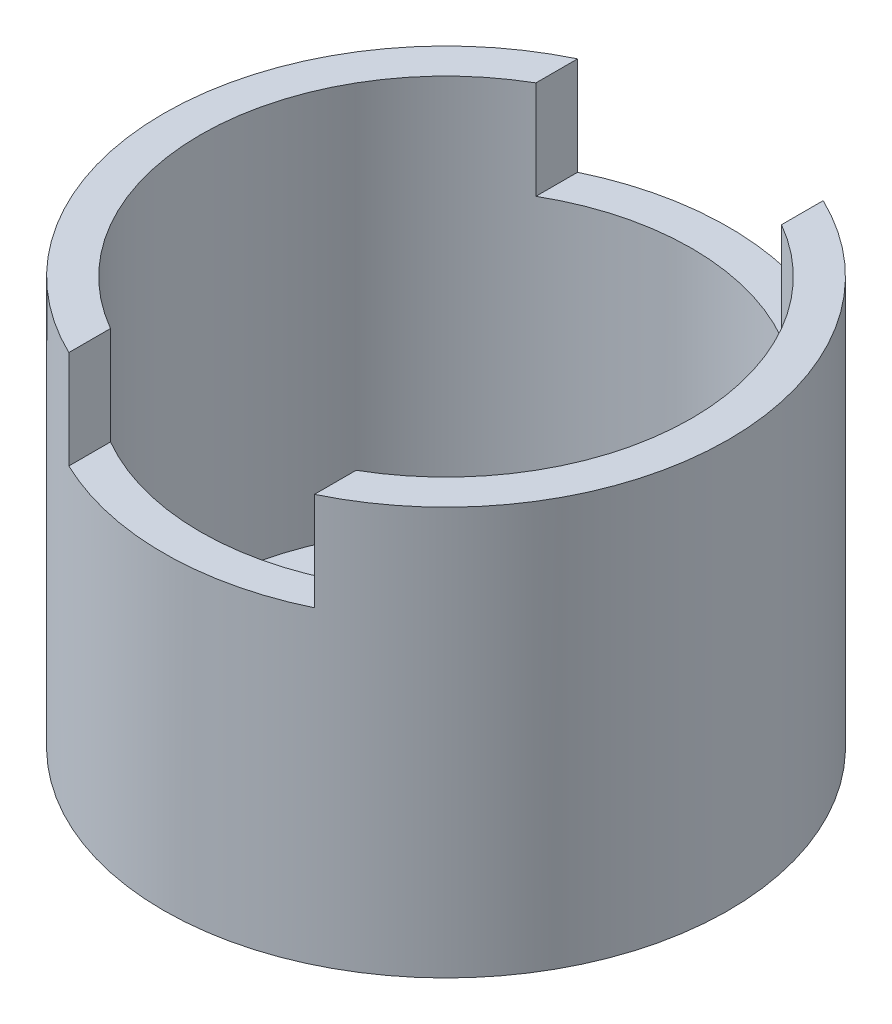
ISO-10303-21;
HEADER;
FILE_DESCRIPTION(('STEP AP214'),'2;1');
FILE_NAME('part.step','',(''),(''),'','','');
FILE_SCHEMA(('AUTOMOTIVE_DESIGN { 1 0 10303 214 1 1 1 1 }'));
ENDSEC;
DATA;
#1=APPLICATION_CONTEXT('core data for automotive mechanical design processes');
#2=APPLICATION_PROTOCOL_DEFINITION('international standard','automotive_design',2000,#1);
#3=PRODUCT_CONTEXT('',#1,'mechanical');
#4=PRODUCT('Part','Part','',(#3));
#5=PRODUCT_RELATED_PRODUCT_CATEGORY('part','',(#4));
#6=PRODUCT_DEFINITION_FORMATION('','',#4);
#7=PRODUCT_DEFINITION_CONTEXT('part definition',#1,'design');
#8=PRODUCT_DEFINITION('design','',#6,#7);
#9=PRODUCT_DEFINITION_SHAPE('','',#8);
#10=(LENGTH_UNIT() NAMED_UNIT(*) SI_UNIT(.MILLI.,.METRE.));
#11=(NAMED_UNIT(*) PLANE_ANGLE_UNIT() SI_UNIT($,.RADIAN.));
#12=(NAMED_UNIT(*) SI_UNIT($,.STERADIAN.) SOLID_ANGLE_UNIT());
#13=UNCERTAINTY_MEASURE_WITH_UNIT(LENGTH_MEASURE(1.E-05),#10,'distance_accuracy_value','');
#14=(GEOMETRIC_REPRESENTATION_CONTEXT(3) GLOBAL_UNCERTAINTY_ASSIGNED_CONTEXT((#13)) GLOBAL_UNIT_ASSIGNED_CONTEXT((#10,
#11,#12)) REPRESENTATION_CONTEXT('',''));
#15=CARTESIAN_POINT('',(0.,0.,0.));
#16=DIRECTION('',(0.,0.,1.));
#17=DIRECTION('',(1.,0.,0.));
#18=AXIS2_PLACEMENT_3D('',#15,#16,#17);
#19=CARTESIAN_POINT('',(0.,0.,0.));
#20=DIRECTION('',(0.,1.,0.));
#21=DIRECTION('',(0.,0.,1.));
#22=AXIS2_PLACEMENT_3D('',#19,#20,#21);
#23=PLANE('',#22);
#24=CARTESIAN_POINT('',(0.,0.,0.));
#25=DIRECTION('',(0.,1.,0.));
#26=DIRECTION('',(0.,0.,1.));
#27=AXIS2_PLACEMENT_3D('',#24,#25,#26);
#28=CIRCLE('',#27,13.5);
#29=CARTESIAN_POINT('',(0.,0.,13.5));
#30=VERTEX_POINT('',#29);
#31=EDGE_CURVE('E217',#30,#30,#28,.T.);
#32=ORIENTED_EDGE('',*,*,#31,.T.);
#33=EDGE_LOOP('',(#32));
#34=FACE_BOUND('',#33,.T.);
#35=CARTESIAN_POINT('',(11.5,0.,-11.5));
#36=DIRECTION('',(0.,1.,0.));
#37=DIRECTION('',(0.,0.,1.));
#38=AXIS2_PLACEMENT_3D('',#35,#36,#37);
#39=CIRCLE('',#38,1.4);
#40=CARTESIAN_POINT('',(11.5,0.,-10.1));
#41=VERTEX_POINT('',#40);
#42=EDGE_CURVE('E222',#41,#41,#39,.T.);
#43=ORIENTED_EDGE('',*,*,#42,.T.);
#44=EDGE_LOOP('',(#43));
#45=FACE_BOUND('',#44,.T.);
#46=CARTESIAN_POINT('',(-11.5,0.,-11.5));
#47=DIRECTION('',(0.,1.,0.));
#48=DIRECTION('',(0.,0.,1.));
#49=AXIS2_PLACEMENT_3D('',#46,#47,#48);
#50=CIRCLE('',#49,1.4);
#51=CARTESIAN_POINT('',(-11.5,0.,-10.1));
#52=VERTEX_POINT('',#51);
#53=EDGE_CURVE('E230',#52,#52,#50,.T.);
#54=ORIENTED_EDGE('',*,*,#53,.T.);
#55=EDGE_LOOP('',(#54));
#56=FACE_BOUND('',#55,.T.);
#57=CARTESIAN_POINT('',(11.5,0.,11.5));
#58=DIRECTION('',(0.,1.,0.));
#59=DIRECTION('',(0.,0.,1.));
#60=AXIS2_PLACEMENT_3D('',#57,#58,#59);
#61=CIRCLE('',#60,1.4);
#62=CARTESIAN_POINT('',(11.5,0.,12.9));
#63=VERTEX_POINT('',#62);
#64=EDGE_CURVE('E238',#63,#63,#61,.T.);
#65=ORIENTED_EDGE('',*,*,#64,.T.);
#66=EDGE_LOOP('',(#65));
#67=FACE_BOUND('',#66,.T.);
#68=CARTESIAN_POINT('',(-11.5,0.,11.5));
#69=DIRECTION('',(0.,1.,0.));
#70=DIRECTION('',(0.,0.,1.));
#71=AXIS2_PLACEMENT_3D('',#68,#69,#70);
#72=CIRCLE('',#71,1.4);
#73=CARTESIAN_POINT('',(-11.5,0.,12.9));
#74=VERTEX_POINT('',#73);
#75=EDGE_CURVE('E246',#74,#74,#72,.T.);
#76=ORIENTED_EDGE('',*,*,#75,.T.);
#77=EDGE_LOOP('',(#76));
#78=FACE_BOUND('',#77,.T.);
#79=CARTESIAN_POINT('',(0.,0.,0.));
#80=DIRECTION('',(0.,1.,0.));
#81=DIRECTION('',(0.,0.,1.));
#82=AXIS2_PLACEMENT_3D('',#79,#80,#81);
#83=CIRCLE('',#82,57.5);
#84=CARTESIAN_POINT('',(0.,0.,57.5));
#85=VERTEX_POINT('',#84);
#86=EDGE_CURVE('E96',#85,#85,#83,.T.);
#87=ORIENTED_EDGE('',*,*,#86,.F.);
#88=EDGE_LOOP('',(#87));
#89=FACE_BOUND('',#88,.T.);
#90=ADVANCED_FACE('F93',(#34,#45,#56,#67,#78,#89),#23,.F.);
#91=CARTESIAN_POINT('',(0.,83.,0.));
#92=DIRECTION('',(0.,1.,0.));
#93=DIRECTION('',(0.,0.,1.));
#94=AXIS2_PLACEMENT_3D('',#91,#92,#93);
#95=PLANE('',#94);
#96=CARTESIAN_POINT('',(0.,83.,0.));
#97=DIRECTION('',(0.,1.,0.));
#98=DIRECTION('',(0.,0.,1.));
#99=AXIS2_PLACEMENT_3D('',#96,#97,#98);
#100=CIRCLE('',#99,57.5);
#101=CARTESIAN_POINT('',(25.,83.,51.78078794302));
#102=VERTEX_POINT('',#101);
#103=CARTESIAN_POINT('',(25.,83.,-51.78078794302));
#104=VERTEX_POINT('',#103);
#105=EDGE_CURVE('E213',#102,#104,#100,.T.);
#106=ORIENTED_EDGE('',*,*,#105,.T.);
#107=DIRECTION('',(0.,0.,1.));
#108=VECTOR('',#107,1.);
#109=CARTESIAN_POINT('',(25.,83.,0.));
#110=LINE('',#109,#108);
#111=CARTESIAN_POINT('',(25.,83.,-43.3012701892219));
#112=VERTEX_POINT('',#111);
#113=EDGE_CURVE('E201',#104,#112,#110,.T.);
#114=ORIENTED_EDGE('',*,*,#113,.T.);
#115=CARTESIAN_POINT('',(0.,83.,0.));
#116=DIRECTION('',(0.,1.,0.));
#117=DIRECTION('',(0.,0.,1.));
#118=AXIS2_PLACEMENT_3D('',#115,#116,#117);
#119=CIRCLE('',#118,50.);
#120=CARTESIAN_POINT('',(25.,83.,43.3012701892219));
#121=VERTEX_POINT('',#120);
#122=EDGE_CURVE('E208',#121,#112,#119,.T.);
#123=ORIENTED_EDGE('',*,*,#122,.F.);
#124=EDGE_CURVE('E171',#121,#102,#110,.T.);
#125=ORIENTED_EDGE('',*,*,#124,.T.);
#126=EDGE_LOOP('',(#106,#114,#123,#125));
#127=FACE_BOUND('',#126,.T.);
#128=ADVANCED_FACE('F294',(#127),#95,.T.);
#129=CARTESIAN_POINT('',(-25.,83.,-51.7807879430199));
#130=VERTEX_POINT('',#129);
#131=CARTESIAN_POINT('',(-25.,83.,51.7807879430199));
#132=VERTEX_POINT('',#131);
#133=EDGE_CURVE('E212',#130,#132,#100,.T.);
#134=ORIENTED_EDGE('',*,*,#133,.T.);
#135=DIRECTION('',(0.,0.,-1.));
#136=VECTOR('',#135,1.);
#137=CARTESIAN_POINT('',(-25.,83.,0.));
#138=LINE('',#137,#136);
#139=CARTESIAN_POINT('',(-25.,83.,43.3012701892219));
#140=VERTEX_POINT('',#139);
#141=EDGE_CURVE('E165',#132,#140,#138,.T.);
#142=ORIENTED_EDGE('',*,*,#141,.T.);
#143=CARTESIAN_POINT('',(-25.,83.,-43.3012701892219));
#144=VERTEX_POINT('',#143);
#145=EDGE_CURVE('E207',#144,#140,#119,.T.);
#146=ORIENTED_EDGE('',*,*,#145,.F.);
#147=EDGE_CURVE('E189',#144,#130,#138,.T.);
#148=ORIENTED_EDGE('',*,*,#147,.T.);
#149=EDGE_LOOP('',(#134,#142,#146,#148));
#150=FACE_BOUND('',#149,.T.);
#151=ADVANCED_FACE('F299',(#150),#95,.T.);
#152=CARTESIAN_POINT('',(0.,83.,0.));
#153=DIRECTION('',(0.,-1.,0.));
#154=DIRECTION('',(0.,0.,-1.));
#155=AXIS2_PLACEMENT_3D('',#152,#153,#154);
#156=CYLINDRICAL_SURFACE('',#155,57.5);
#157=DIRECTION('',(0.,-1.,0.));
#158=VECTOR('',#157,1.);
#159=CARTESIAN_POINT('',(25.,83.,-51.78078794302));
#160=LINE('',#159,#158);
#161=CARTESIAN_POINT('',(25.,63.,-51.78078794302));
#162=VERTEX_POINT('',#161);
#163=EDGE_CURVE('E204',#104,#162,#160,.T.);
#164=ORIENTED_EDGE('',*,*,#163,.F.);
#165=ORIENTED_EDGE('',*,*,#105,.F.);
#166=DIRECTION('',(0.,-1.,0.));
#167=VECTOR('',#166,1.);
#168=CARTESIAN_POINT('',(25.,83.,51.78078794302));
#169=LINE('',#168,#167);
#170=CARTESIAN_POINT('',(25.,63.,51.78078794302));
#171=VERTEX_POINT('',#170);
#172=EDGE_CURVE('E184',#171,#102,#169,.F.);
#173=ORIENTED_EDGE('',*,*,#172,.F.);
#174=CARTESIAN_POINT('',(0.,63.,0.));
#175=DIRECTION('',(0.,1.,0.));
#176=DIRECTION('',(0.,0.,1.));
#177=AXIS2_PLACEMENT_3D('',#174,#175,#176);
#178=CIRCLE('',#177,57.5);
#179=CARTESIAN_POINT('',(-25.,63.,51.7807879430199));
#180=VERTEX_POINT('',#179);
#181=EDGE_CURVE('E174',#180,#171,#178,.T.);
#182=ORIENTED_EDGE('',*,*,#181,.F.);
#183=DIRECTION('',(0.,-1.,0.));
#184=VECTOR('',#183,1.);
#185=CARTESIAN_POINT('',(-25.,83.,51.7807879430199));
#186=LINE('',#185,#184);
#187=EDGE_CURVE('E159',#132,#180,#186,.T.);
#188=ORIENTED_EDGE('',*,*,#187,.F.);
#189=ORIENTED_EDGE('',*,*,#133,.F.);
#190=DIRECTION('',(0.,-1.,0.));
#191=VECTOR('',#190,1.);
#192=CARTESIAN_POINT('',(-25.,83.,-51.7807879430199));
#193=LINE('',#192,#191);
#194=CARTESIAN_POINT('',(-25.,63.,-51.7807879430199));
#195=VERTEX_POINT('',#194);
#196=EDGE_CURVE('E195',#195,#130,#193,.F.);
#197=ORIENTED_EDGE('',*,*,#196,.F.);
#198=EDGE_CURVE('E186',#162,#195,#178,.T.);
#199=ORIENTED_EDGE('',*,*,#198,.F.);
#200=EDGE_LOOP('',(#164,#165,#173,#182,#188,#189,#197,#199));
#201=FACE_BOUND('',#200,.T.);
#202=ORIENTED_EDGE('',*,*,#86,.T.);
#203=EDGE_LOOP('',(#202));
#204=FACE_BOUND('',#203,.T.);
#205=ADVANCED_FACE('F181',(#201,#204),#156,.T.);
#206=CARTESIAN_POINT('',(0.,83.,0.));
#207=DIRECTION('',(0.,-1.,0.));
#208=DIRECTION('',(0.,0.,-1.));
#209=AXIS2_PLACEMENT_3D('',#206,#207,#208);
#210=CYLINDRICAL_SURFACE('',#209,50.);
#211=CARTESIAN_POINT('',(0.,3.,0.));
#212=DIRECTION('',(0.,1.,0.));
#213=DIRECTION('',(0.,0.,1.));
#214=AXIS2_PLACEMENT_3D('',#211,#212,#213);
#215=CIRCLE('',#214,50.);
#216=CARTESIAN_POINT('',(0.,3.,50.));
#217=VERTEX_POINT('',#216);
#218=EDGE_CURVE('E254',#217,#217,#215,.F.);
#219=ORIENTED_EDGE('',*,*,#218,.T.);
#220=EDGE_LOOP('',(#219));
#221=FACE_BOUND('',#220,.T.);
#222=ORIENTED_EDGE('',*,*,#122,.T.);
#223=DIRECTION('',(0.,-1.,0.));
#224=VECTOR('',#223,1.);
#225=CARTESIAN_POINT('',(25.,83.,-43.3012701892219));
#226=LINE('',#225,#224);
#227=CARTESIAN_POINT('',(25.,63.,-43.3012701892219));
#228=VERTEX_POINT('',#227);
#229=EDGE_CURVE('E12',#112,#228,#226,.T.);
#230=ORIENTED_EDGE('',*,*,#229,.T.);
#231=CARTESIAN_POINT('',(0.,63.,0.));
#232=DIRECTION('',(0.,1.,0.));
#233=DIRECTION('',(0.,0.,1.));
#234=AXIS2_PLACEMENT_3D('',#231,#232,#233);
#235=CIRCLE('',#234,50.);
#236=CARTESIAN_POINT('',(-25.,63.,-43.3012701892219));
#237=VERTEX_POINT('',#236);
#238=EDGE_CURVE('E264',#228,#237,#235,.T.);
#239=ORIENTED_EDGE('',*,*,#238,.T.);
#240=DIRECTION('',(0.,-1.,0.));
#241=VECTOR('',#240,1.);
#242=CARTESIAN_POINT('',(-25.,83.,-43.3012701892219));
#243=LINE('',#242,#241);
#244=EDGE_CURVE('E102',#237,#144,#243,.F.);
#245=ORIENTED_EDGE('',*,*,#244,.T.);
#246=ORIENTED_EDGE('',*,*,#145,.T.);
#247=DIRECTION('',(0.,-1.,0.));
#248=VECTOR('',#247,1.);
#249=CARTESIAN_POINT('',(-25.,83.,43.3012701892219));
#250=LINE('',#249,#248);
#251=CARTESIAN_POINT('',(-25.,63.,43.3012701892219));
#252=VERTEX_POINT('',#251);
#253=EDGE_CURVE('E263',#140,#252,#250,.T.);
#254=ORIENTED_EDGE('',*,*,#253,.T.);
#255=CARTESIAN_POINT('',(25.,63.,43.3012701892219));
#256=VERTEX_POINT('',#255);
#257=EDGE_CURVE('E176',#252,#256,#235,.T.);
#258=ORIENTED_EDGE('',*,*,#257,.T.);
#259=DIRECTION('',(0.,-1.,0.));
#260=VECTOR('',#259,1.);
#261=CARTESIAN_POINT('',(25.,83.,43.3012701892219));
#262=LINE('',#261,#260);
#263=EDGE_CURVE('E267',#256,#121,#262,.F.);
#264=ORIENTED_EDGE('',*,*,#263,.T.);
#265=EDGE_LOOP('',(#222,#230,#239,#245,#246,#254,#258,#264));
#266=FACE_BOUND('',#265,.T.);
#267=ADVANCED_FACE('F278',(#221,#266),#210,.F.);
#268=CARTESIAN_POINT('',(0.,3.,0.));
#269=DIRECTION('',(0.,1.,0.));
#270=DIRECTION('',(0.,0.,1.));
#271=AXIS2_PLACEMENT_3D('',#268,#269,#270);
#272=PLANE('',#271);
#273=CARTESIAN_POINT('',(0.,3.,0.));
#274=DIRECTION('',(0.,1.,0.));
#275=DIRECTION('',(0.,0.,1.));
#276=AXIS2_PLACEMENT_3D('',#273,#274,#275);
#277=CIRCLE('',#276,13.5);
#278=CARTESIAN_POINT('',(0.,3.,13.5));
#279=VERTEX_POINT('',#278);
#280=EDGE_CURVE('E218',#279,#279,#277,.T.);
#281=ORIENTED_EDGE('',*,*,#280,.F.);
#282=EDGE_LOOP('',(#281));
#283=FACE_BOUND('',#282,.T.);
#284=CARTESIAN_POINT('',(-11.5,3.,-11.5));
#285=DIRECTION('',(0.,1.,0.));
#286=DIRECTION('',(0.,0.,1.));
#287=AXIS2_PLACEMENT_3D('',#284,#285,#286);
#288=CIRCLE('',#287,1.4);
#289=CARTESIAN_POINT('',(-11.5,3.,-10.1));
#290=VERTEX_POINT('',#289);
#291=EDGE_CURVE('E234',#290,#290,#288,.T.);
#292=ORIENTED_EDGE('',*,*,#291,.F.);
#293=EDGE_LOOP('',(#292));
#294=FACE_BOUND('',#293,.T.);
#295=CARTESIAN_POINT('',(-11.5,3.,11.5));
#296=DIRECTION('',(0.,1.,0.));
#297=DIRECTION('',(0.,0.,1.));
#298=AXIS2_PLACEMENT_3D('',#295,#296,#297);
#299=CIRCLE('',#298,1.4);
#300=CARTESIAN_POINT('',(-11.5,3.,12.9));
#301=VERTEX_POINT('',#300);
#302=EDGE_CURVE('E250',#301,#301,#299,.T.);
#303=ORIENTED_EDGE('',*,*,#302,.F.);
#304=EDGE_LOOP('',(#303));
#305=FACE_BOUND('',#304,.T.);
#306=CARTESIAN_POINT('',(11.5,3.,11.5));
#307=DIRECTION('',(0.,1.,0.));
#308=DIRECTION('',(0.,0.,1.));
#309=AXIS2_PLACEMENT_3D('',#306,#307,#308);
#310=CIRCLE('',#309,1.4);
#311=CARTESIAN_POINT('',(11.5,3.,12.9));
#312=VERTEX_POINT('',#311);
#313=EDGE_CURVE('E242',#312,#312,#310,.T.);
#314=ORIENTED_EDGE('',*,*,#313,.F.);
#315=EDGE_LOOP('',(#314));
#316=FACE_BOUND('',#315,.T.);
#317=CARTESIAN_POINT('',(11.5,3.,-11.5));
#318=DIRECTION('',(0.,1.,0.));
#319=DIRECTION('',(0.,0.,1.));
#320=AXIS2_PLACEMENT_3D('',#317,#318,#319);
#321=CIRCLE('',#320,1.4);
#322=CARTESIAN_POINT('',(11.5,3.,-10.1));
#323=VERTEX_POINT('',#322);
#324=EDGE_CURVE('E226',#323,#323,#321,.T.);
#325=ORIENTED_EDGE('',*,*,#324,.F.);
#326=EDGE_LOOP('',(#325));
#327=FACE_BOUND('',#326,.T.);
#328=ORIENTED_EDGE('',*,*,#218,.F.);
#329=EDGE_LOOP('',(#328));
#330=FACE_BOUND('',#329,.T.);
#331=ADVANCED_FACE('F315',(#283,#294,#305,#316,#327,#330),#272,.T.);
#332=CARTESIAN_POINT('',(-11.5,3.,11.5));
#333=DIRECTION('',(0.,-1.,0.));
#334=DIRECTION('',(0.,0.,-1.));
#335=AXIS2_PLACEMENT_3D('',#332,#333,#334);
#336=CYLINDRICAL_SURFACE('',#335,1.4);
#337=ORIENTED_EDGE('',*,*,#302,.T.);
#338=EDGE_LOOP('',(#337));
#339=FACE_BOUND('',#338,.T.);
#340=ORIENTED_EDGE('',*,*,#75,.F.);
#341=EDGE_LOOP('',(#340));
#342=FACE_BOUND('',#341,.T.);
#343=ADVANCED_FACE('F312',(#339,#342),#336,.F.);
#344=CARTESIAN_POINT('',(11.5,3.,11.5));
#345=DIRECTION('',(0.,-1.,0.));
#346=DIRECTION('',(0.,0.,-1.));
#347=AXIS2_PLACEMENT_3D('',#344,#345,#346);
#348=CYLINDRICAL_SURFACE('',#347,1.4);
#349=ORIENTED_EDGE('',*,*,#313,.T.);
#350=EDGE_LOOP('',(#349));
#351=FACE_BOUND('',#350,.T.);
#352=ORIENTED_EDGE('',*,*,#64,.F.);
#353=EDGE_LOOP('',(#352));
#354=FACE_BOUND('',#353,.T.);
#355=ADVANCED_FACE('F314',(#351,#354),#348,.F.);
#356=CARTESIAN_POINT('',(-11.5,3.,-11.5));
#357=DIRECTION('',(0.,-1.,0.));
#358=DIRECTION('',(0.,0.,-1.));
#359=AXIS2_PLACEMENT_3D('',#356,#357,#358);
#360=CYLINDRICAL_SURFACE('',#359,1.4);
#361=ORIENTED_EDGE('',*,*,#291,.T.);
#362=EDGE_LOOP('',(#361));
#363=FACE_BOUND('',#362,.T.);
#364=ORIENTED_EDGE('',*,*,#53,.F.);
#365=EDGE_LOOP('',(#364));
#366=FACE_BOUND('',#365,.T.);
#367=ADVANCED_FACE('F322',(#363,#366),#360,.F.);
#368=CARTESIAN_POINT('',(11.5,3.,-11.5));
#369=DIRECTION('',(0.,-1.,0.));
#370=DIRECTION('',(0.,0.,-1.));
#371=AXIS2_PLACEMENT_3D('',#368,#369,#370);
#372=CYLINDRICAL_SURFACE('',#371,1.4);
#373=ORIENTED_EDGE('',*,*,#324,.T.);
#374=EDGE_LOOP('',(#373));
#375=FACE_BOUND('',#374,.T.);
#376=ORIENTED_EDGE('',*,*,#42,.F.);
#377=EDGE_LOOP('',(#376));
#378=FACE_BOUND('',#377,.T.);
#379=ADVANCED_FACE('F329',(#375,#378),#372,.F.);
#380=CARTESIAN_POINT('',(0.,3.,0.));
#381=DIRECTION('',(0.,-1.,0.));
#382=DIRECTION('',(0.,0.,-1.));
#383=AXIS2_PLACEMENT_3D('',#380,#381,#382);
#384=CYLINDRICAL_SURFACE('',#383,13.5);
#385=ORIENTED_EDGE('',*,*,#280,.T.);
#386=EDGE_LOOP('',(#385));
#387=FACE_BOUND('',#386,.T.);
#388=ORIENTED_EDGE('',*,*,#31,.F.);
#389=EDGE_LOOP('',(#388));
#390=FACE_BOUND('',#389,.T.);
#391=ADVANCED_FACE('F333',(#387,#390),#384,.F.);
#392=CARTESIAN_POINT('',(-25.,63.,80.));
#393=DIRECTION('',(0.,1.,0.));
#394=DIRECTION('',(0.,0.,1.));
#395=AXIS2_PLACEMENT_3D('',#392,#393,#394);
#396=PLANE('',#395);
#397=ORIENTED_EDGE('',*,*,#181,.T.);
#398=DIRECTION('',(0.,0.,-1.));
#399=VECTOR('',#398,1.);
#400=CARTESIAN_POINT('',(25.,63.,80.));
#401=LINE('',#400,#399);
#402=EDGE_CURVE('E117',#171,#256,#401,.T.);
#403=ORIENTED_EDGE('',*,*,#402,.T.);
#404=ORIENTED_EDGE('',*,*,#257,.F.);
#405=DIRECTION('',(0.,0.,-1.));
#406=VECTOR('',#405,1.);
#407=CARTESIAN_POINT('',(-25.,63.,80.));
#408=LINE('',#407,#406);
#409=EDGE_CURVE('E162',#180,#252,#408,.T.);
#410=ORIENTED_EDGE('',*,*,#409,.F.);
#411=EDGE_LOOP('',(#397,#403,#404,#410));
#412=FACE_BOUND('',#411,.T.);
#413=ADVANCED_FACE('F173',(#412),#396,.T.);
#414=CARTESIAN_POINT('',(-25.,103.,80.));
#415=DIRECTION('',(1.,0.,0.));
#416=DIRECTION('',(0.,1.,0.));
#417=AXIS2_PLACEMENT_3D('',#414,#415,#416);
#418=PLANE('',#417);
#419=ORIENTED_EDGE('',*,*,#187,.T.);
#420=ORIENTED_EDGE('',*,*,#409,.T.);
#421=ORIENTED_EDGE('',*,*,#253,.F.);
#422=ORIENTED_EDGE('',*,*,#141,.F.);
#423=EDGE_LOOP('',(#419,#420,#421,#422));
#424=FACE_BOUND('',#423,.T.);
#425=ADVANCED_FACE('F161',(#424),#418,.T.);
#426=CARTESIAN_POINT('',(25.,103.,80.));
#427=DIRECTION('',(-1.,0.,0.));
#428=DIRECTION('',(0.,-1.,0.));
#429=AXIS2_PLACEMENT_3D('',#426,#427,#428);
#430=PLANE('',#429);
#431=ORIENTED_EDGE('',*,*,#172,.T.);
#432=ORIENTED_EDGE('',*,*,#124,.F.);
#433=ORIENTED_EDGE('',*,*,#263,.F.);
#434=ORIENTED_EDGE('',*,*,#402,.F.);
#435=EDGE_LOOP('',(#431,#432,#433,#434));
#436=FACE_BOUND('',#435,.T.);
#437=ADVANCED_FACE('F346',(#436),#430,.T.);
#438=ORIENTED_EDGE('',*,*,#163,.T.);
#439=EDGE_CURVE('E282',#228,#162,#401,.T.);
#440=ORIENTED_EDGE('',*,*,#439,.F.);
#441=ORIENTED_EDGE('',*,*,#229,.F.);
#442=ORIENTED_EDGE('',*,*,#113,.F.);
#443=EDGE_LOOP('',(#438,#440,#441,#442));
#444=FACE_BOUND('',#443,.T.);
#445=ADVANCED_FACE('F285',(#444),#430,.T.);
#446=ORIENTED_EDGE('',*,*,#196,.T.);
#447=ORIENTED_EDGE('',*,*,#147,.F.);
#448=ORIENTED_EDGE('',*,*,#244,.F.);
#449=EDGE_CURVE('E109',#237,#195,#408,.T.);
#450=ORIENTED_EDGE('',*,*,#449,.T.);
#451=EDGE_LOOP('',(#446,#447,#448,#450));
#452=FACE_BOUND('',#451,.T.);
#453=ADVANCED_FACE('F345',(#452),#418,.T.);
#454=ORIENTED_EDGE('',*,*,#198,.T.);
#455=ORIENTED_EDGE('',*,*,#449,.F.);
#456=ORIENTED_EDGE('',*,*,#238,.F.);
#457=ORIENTED_EDGE('',*,*,#439,.T.);
#458=EDGE_LOOP('',(#454,#455,#456,#457));
#459=FACE_BOUND('',#458,.T.);
#460=ADVANCED_FACE('F281',(#459),#396,.T.);
#461=CLOSED_SHELL('',(#90,#128,#151,#205,#267,#331,#343,#355,#367,#379,#391,#413,#425,#437,#445,
#453,#460));
#462=MANIFOLD_SOLID_BREP('B2',#461);
#463=ADVANCED_BREP_SHAPE_REPRESENTATION('',(#18,#462),#14);
#464=SHAPE_DEFINITION_REPRESENTATION(#9,#463);
ENDSEC;
END-ISO-10303-21;
